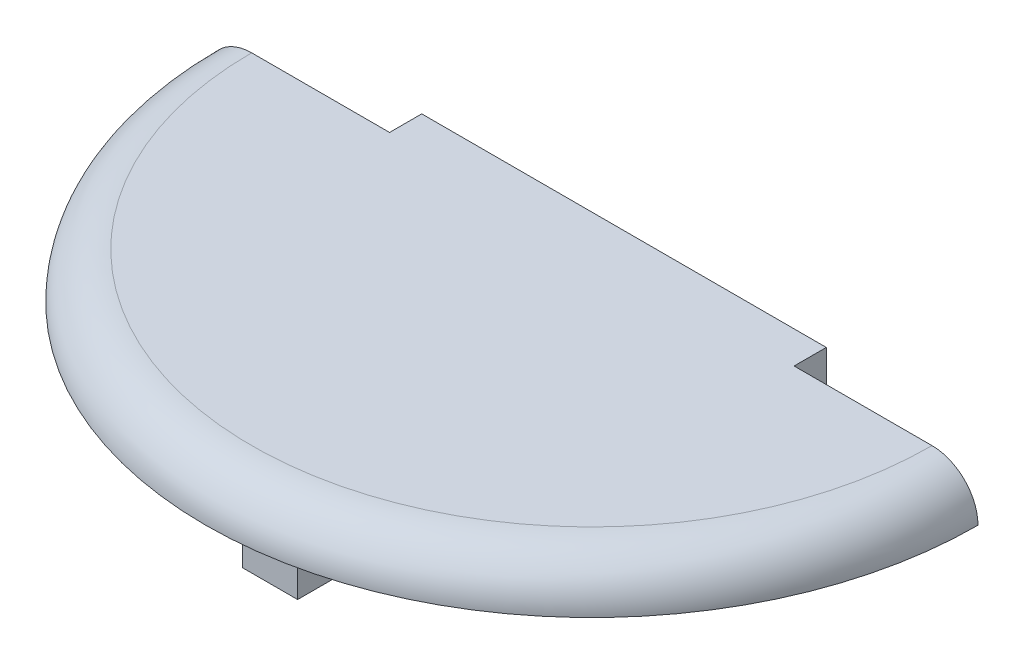
ISO-10303-21;
HEADER;
FILE_DESCRIPTION(('STEP AP214'),'2;1');
FILE_NAME('part.step','',(''),(''),'','','');
FILE_SCHEMA(('AUTOMOTIVE_DESIGN { 1 0 10303 214 1 1 1 1 }'));
ENDSEC;
DATA;
#1=APPLICATION_CONTEXT('core data for automotive mechanical design processes');
#2=APPLICATION_PROTOCOL_DEFINITION('international standard','automotive_design',2000,#1);
#3=PRODUCT_CONTEXT('',#1,'mechanical');
#4=PRODUCT('Part','Part','',(#3));
#5=PRODUCT_RELATED_PRODUCT_CATEGORY('part','',(#4));
#6=PRODUCT_DEFINITION_FORMATION('','',#4);
#7=PRODUCT_DEFINITION_CONTEXT('part definition',#1,'design');
#8=PRODUCT_DEFINITION('design','',#6,#7);
#9=PRODUCT_DEFINITION_SHAPE('','',#8);
#10=(LENGTH_UNIT() NAMED_UNIT(*) SI_UNIT(.MILLI.,.METRE.));
#11=(NAMED_UNIT(*) PLANE_ANGLE_UNIT() SI_UNIT($,.RADIAN.));
#12=(NAMED_UNIT(*) SI_UNIT($,.STERADIAN.) SOLID_ANGLE_UNIT());
#13=UNCERTAINTY_MEASURE_WITH_UNIT(LENGTH_MEASURE(1.E-05),#10,'distance_accuracy_value','');
#14=(GEOMETRIC_REPRESENTATION_CONTEXT(3) GLOBAL_UNCERTAINTY_ASSIGNED_CONTEXT((#13)) GLOBAL_UNIT_ASSIGNED_CONTEXT((#10,
#11,#12)) REPRESENTATION_CONTEXT('',''));
#15=CARTESIAN_POINT('',(0.,0.,0.));
#16=DIRECTION('',(0.,0.,1.));
#17=DIRECTION('',(1.,0.,0.));
#18=AXIS2_PLACEMENT_3D('',#15,#16,#17);
#19=CARTESIAN_POINT('',(-2.99999999999999,47.,32.));
#20=DIRECTION('',(0.,0.,1.));
#21=DIRECTION('',(1.,0.,0.));
#22=AXIS2_PLACEMENT_3D('',#19,#20,#21);
#23=PLANE('',#22);
#24=DIRECTION('',(1.,0.,0.));
#25=VECTOR('',#24,1.);
#26=CARTESIAN_POINT('',(-2.99999999999999,48.,32.));
#27=LINE('',#26,#25);
#28=CARTESIAN_POINT('',(-2.99999999999999,48.,32.));
#29=VERTEX_POINT('',#28);
#30=CARTESIAN_POINT('',(3.00000000000001,48.,32.));
#31=VERTEX_POINT('',#30);
#32=EDGE_CURVE('E12',#29,#31,#27,.T.);
#33=ORIENTED_EDGE('',*,*,#32,.F.);
#34=DIRECTION('',(0.,1.,0.));
#35=VECTOR('',#34,1.);
#36=CARTESIAN_POINT('',(-2.99999999999999,47.,32.));
#37=LINE('',#36,#35);
#38=CARTESIAN_POINT('',(-2.99999999999999,55.,32.));
#39=VERTEX_POINT('',#38);
#40=EDGE_CURVE('E226',#29,#39,#37,.T.);
#41=ORIENTED_EDGE('',*,*,#40,.T.);
#42=DIRECTION('',(1.,0.,0.));
#43=VECTOR('',#42,1.);
#44=CARTESIAN_POINT('',(-2.99999999999999,55.,32.));
#45=LINE('',#44,#43);
#46=CARTESIAN_POINT('',(3.00000000000001,55.,32.));
#47=VERTEX_POINT('',#46);
#48=EDGE_CURVE('E219',#39,#47,#45,.T.);
#49=ORIENTED_EDGE('',*,*,#48,.T.);
#50=DIRECTION('',(0.,1.,0.));
#51=VECTOR('',#50,1.);
#52=CARTESIAN_POINT('',(3.00000000000001,47.,32.));
#53=LINE('',#52,#51);
#54=EDGE_CURVE('E223',#31,#47,#53,.T.);
#55=ORIENTED_EDGE('',*,*,#54,.F.);
#56=EDGE_LOOP('',(#33,#41,#49,#55));
#57=FACE_BOUND('',#56,.T.);
#58=ADVANCED_FACE('F42',(#57),#23,.F.);
#59=CARTESIAN_POINT('',(0.,55.,0.));
#60=DIRECTION('',(0.,1.,0.));
#61=DIRECTION('',(0.,0.,1.));
#62=AXIS2_PLACEMENT_3D('',#59,#60,#61);
#63=PLANE('',#62);
#64=DIRECTION('',(0.,0.,-1.));
#65=VECTOR('',#64,1.);
#66=CARTESIAN_POINT('',(-22.,55.,0.));
#67=LINE('',#66,#65);
#68=CARTESIAN_POINT('',(-22.,55.,0.));
#69=VERTEX_POINT('',#68);
#70=CARTESIAN_POINT('',(-22.,55.,-3.5));
#71=VERTEX_POINT('',#70);
#72=EDGE_CURVE('E144',#69,#71,#67,.T.);
#73=ORIENTED_EDGE('',*,*,#72,.T.);
#74=DIRECTION('',(1.,0.,0.));
#75=VECTOR('',#74,1.);
#76=CARTESIAN_POINT('',(-22.,55.,-3.5));
#77=LINE('',#76,#75);
#78=CARTESIAN_POINT('',(22.,55.,-3.5));
#79=VERTEX_POINT('',#78);
#80=EDGE_CURVE('E130',#71,#79,#77,.T.);
#81=ORIENTED_EDGE('',*,*,#80,.T.);
#82=DIRECTION('',(0.,0.,1.));
#83=VECTOR('',#82,1.);
#84=CARTESIAN_POINT('',(22.,55.,0.));
#85=LINE('',#84,#83);
#86=CARTESIAN_POINT('',(22.,55.,0.));
#87=VERTEX_POINT('',#86);
#88=EDGE_CURVE('E156',#79,#87,#85,.T.);
#89=ORIENTED_EDGE('',*,*,#88,.T.);
#90=DIRECTION('',(1.,0.,0.));
#91=VECTOR('',#90,1.);
#92=CARTESIAN_POINT('',(0.,55.,0.));
#93=LINE('',#92,#91);
#94=CARTESIAN_POINT('',(42.,55.,0.));
#95=VERTEX_POINT('',#94);
#96=EDGE_CURVE('E163',#87,#95,#93,.T.);
#97=ORIENTED_EDGE('',*,*,#96,.T.);
#98=CARTESIAN_POINT('',(0.,55.,0.));
#99=DIRECTION('',(0.,-1.,0.));
#100=DIRECTION('',(0.,0.,-1.));
#101=AXIS2_PLACEMENT_3D('',#98,#99,#100);
#102=CIRCLE('',#101,42.);
#103=CARTESIAN_POINT('',(-42.,55.,0.));
#104=VERTEX_POINT('',#103);
#105=EDGE_CURVE('E52',#95,#104,#102,.T.);
#106=ORIENTED_EDGE('',*,*,#105,.T.);
#107=DIRECTION('',(1.,0.,0.));
#108=VECTOR('',#107,1.);
#109=CARTESIAN_POINT('',(0.,55.,0.));
#110=LINE('',#109,#108);
#111=EDGE_CURVE('E153',#104,#69,#110,.T.);
#112=ORIENTED_EDGE('',*,*,#111,.T.);
#113=EDGE_LOOP('',(#73,#81,#89,#97,#106,#112));
#114=FACE_BOUND('',#113,.T.);
#115=DIRECTION('',(0.,0.,1.));
#116=VECTOR('',#115,1.);
#117=CARTESIAN_POINT('',(3.00000000000001,55.,35.));
#118=LINE('',#117,#116);
#119=CARTESIAN_POINT('',(3.00000000000001,55.,35.));
#120=VERTEX_POINT('',#119);
#121=EDGE_CURVE('E205',#47,#120,#118,.T.);
#122=ORIENTED_EDGE('',*,*,#121,.F.);
#123=ORIENTED_EDGE('',*,*,#48,.F.);
#124=DIRECTION('',(0.,0.,-1.));
#125=VECTOR('',#124,1.);
#126=CARTESIAN_POINT('',(-2.99999999999999,55.,35.));
#127=LINE('',#126,#125);
#128=CARTESIAN_POINT('',(-2.99999999999999,55.,35.));
#129=VERTEX_POINT('',#128);
#130=EDGE_CURVE('E215',#129,#39,#127,.T.);
#131=ORIENTED_EDGE('',*,*,#130,.F.);
#132=DIRECTION('',(-1.,0.,0.));
#133=VECTOR('',#132,1.);
#134=CARTESIAN_POINT('',(-2.99999999999999,55.,35.));
#135=LINE('',#134,#133);
#136=EDGE_CURVE('E211',#120,#129,#135,.T.);
#137=ORIENTED_EDGE('',*,*,#136,.F.);
#138=EDGE_LOOP('',(#122,#123,#131,#137));
#139=FACE_BOUND('',#138,.T.);
#140=ADVANCED_FACE('F44',(#114,#139),#63,.F.);
#141=CARTESIAN_POINT('',(37.,60.,0.));
#142=DIRECTION('',(0.,1.,0.));
#143=DIRECTION('',(0.,0.,1.));
#144=AXIS2_PLACEMENT_3D('',#141,#142,#143);
#145=PLANE('',#144);
#146=DIRECTION('',(1.,0.,0.));
#147=VECTOR('',#146,1.);
#148=CARTESIAN_POINT('',(-22.,60.,-3.5));
#149=LINE('',#148,#147);
#150=CARTESIAN_POINT('',(-22.,60.,-3.5));
#151=VERTEX_POINT('',#150);
#152=CARTESIAN_POINT('',(22.,60.,-3.5));
#153=VERTEX_POINT('',#152);
#154=EDGE_CURVE('E60',#151,#153,#149,.T.);
#155=ORIENTED_EDGE('',*,*,#154,.F.);
#156=DIRECTION('',(0.,0.,-1.));
#157=VECTOR('',#156,1.);
#158=CARTESIAN_POINT('',(-22.,60.,-7.));
#159=LINE('',#158,#157);
#160=CARTESIAN_POINT('',(-22.,60.,0.));
#161=VERTEX_POINT('',#160);
#162=EDGE_CURVE('E147',#161,#151,#159,.T.);
#163=ORIENTED_EDGE('',*,*,#162,.F.);
#164=DIRECTION('',(1.,0.,0.));
#165=VECTOR('',#164,1.);
#166=CARTESIAN_POINT('',(-42.,60.,0.));
#167=LINE('',#166,#165);
#168=CARTESIAN_POINT('',(-37.,60.,0.));
#169=VERTEX_POINT('',#168);
#170=EDGE_CURVE('E258',#169,#161,#167,.T.);
#171=ORIENTED_EDGE('',*,*,#170,.F.);
#172=CARTESIAN_POINT('',(0.,60.,0.));
#173=DIRECTION('',(0.,-1.,0.));
#174=DIRECTION('',(0.,0.,-1.));
#175=AXIS2_PLACEMENT_3D('',#172,#173,#174);
#176=CIRCLE('',#175,37.);
#177=CARTESIAN_POINT('',(37.,60.,0.));
#178=VERTEX_POINT('',#177);
#179=EDGE_CURVE('E241',#178,#169,#176,.T.);
#180=ORIENTED_EDGE('',*,*,#179,.F.);
#181=DIRECTION('',(1.,0.,0.));
#182=VECTOR('',#181,1.);
#183=CARTESIAN_POINT('',(42.,60.,0.));
#184=LINE('',#183,#182);
#185=CARTESIAN_POINT('',(22.,60.,0.));
#186=VERTEX_POINT('',#185);
#187=EDGE_CURVE('E265',#186,#178,#184,.T.);
#188=ORIENTED_EDGE('',*,*,#187,.F.);
#189=DIRECTION('',(0.,0.,1.));
#190=VECTOR('',#189,1.);
#191=CARTESIAN_POINT('',(22.,60.,-7.));
#192=LINE('',#191,#190);
#193=EDGE_CURVE('E262',#153,#186,#192,.T.);
#194=ORIENTED_EDGE('',*,*,#193,.F.);
#195=EDGE_LOOP('',(#155,#163,#171,#180,#188,#194));
#196=FACE_BOUND('',#195,.T.);
#197=ADVANCED_FACE('F295',(#196),#145,.T.);
#198=CARTESIAN_POINT('',(0.,55.,0.));
#199=DIRECTION('',(0.,-1.,0.));
#200=DIRECTION('',(0.,0.,-1.));
#201=AXIS2_PLACEMENT_3D('',#198,#199,#200);
#202=TOROIDAL_SURFACE('',#201,37.,5.);
#203=CARTESIAN_POINT('',(-37.,55.,0.));
#204=DIRECTION('',(0.,0.,1.));
#205=DIRECTION('',(1.,0.,0.));
#206=AXIS2_PLACEMENT_3D('',#203,#204,#205);
#207=CIRCLE('',#206,5.);
#208=EDGE_CURVE('E238',#104,#169,#207,.F.);
#209=ORIENTED_EDGE('',*,*,#208,.F.);
#210=ORIENTED_EDGE('',*,*,#105,.F.);
#211=CARTESIAN_POINT('',(37.,55.,0.));
#212=DIRECTION('',(0.,0.,1.));
#213=DIRECTION('',(1.,0.,0.));
#214=AXIS2_PLACEMENT_3D('',#211,#212,#213);
#215=CIRCLE('',#214,5.);
#216=EDGE_CURVE('E235',#178,#95,#215,.F.);
#217=ORIENTED_EDGE('',*,*,#216,.F.);
#218=ORIENTED_EDGE('',*,*,#179,.T.);
#219=EDGE_LOOP('',(#209,#210,#217,#218));
#220=FACE_BOUND('',#219,.T.);
#221=ADVANCED_FACE('F300',(#220),#202,.T.);
#222=CARTESIAN_POINT('',(3.00000000000001,47.,35.));
#223=DIRECTION('',(-1.,0.,0.));
#224=DIRECTION('',(0.,0.,1.));
#225=AXIS2_PLACEMENT_3D('',#222,#223,#224);
#226=PLANE('',#225);
#227=DIRECTION('',(0.,0.,1.));
#228=VECTOR('',#227,1.);
#229=CARTESIAN_POINT('',(3.00000000000001,48.,35.));
#230=LINE('',#229,#228);
#231=CARTESIAN_POINT('',(3.00000000000001,48.,29.));
#232=VERTEX_POINT('',#231);
#233=EDGE_CURVE('E197',#232,#31,#230,.T.);
#234=ORIENTED_EDGE('',*,*,#233,.T.);
#235=ORIENTED_EDGE('',*,*,#54,.T.);
#236=ORIENTED_EDGE('',*,*,#121,.T.);
#237=DIRECTION('',(0.,1.,0.));
#238=VECTOR('',#237,1.);
#239=CARTESIAN_POINT('',(3.00000000000001,47.,35.));
#240=LINE('',#239,#238);
#241=CARTESIAN_POINT('',(3.00000000000001,46.,35.));
#242=VERTEX_POINT('',#241);
#243=EDGE_CURVE('E232',#242,#120,#240,.T.);
#244=ORIENTED_EDGE('',*,*,#243,.F.);
#245=DIRECTION('',(0.,0.,1.));
#246=VECTOR('',#245,1.);
#247=CARTESIAN_POINT('',(3.00000000000001,46.,35.));
#248=LINE('',#247,#246);
#249=CARTESIAN_POINT('',(3.00000000000001,46.,29.));
#250=VERTEX_POINT('',#249);
#251=EDGE_CURVE('E182',#250,#242,#248,.T.);
#252=ORIENTED_EDGE('',*,*,#251,.F.);
#253=DIRECTION('',(0.,-1.,0.));
#254=VECTOR('',#253,1.);
#255=CARTESIAN_POINT('',(3.00000000000001,48.,29.));
#256=LINE('',#255,#254);
#257=EDGE_CURVE('E202',#232,#250,#256,.T.);
#258=ORIENTED_EDGE('',*,*,#257,.F.);
#259=EDGE_LOOP('',(#234,#235,#236,#244,#252,#258));
#260=FACE_BOUND('',#259,.T.);
#261=ADVANCED_FACE('F345',(#260),#226,.F.);
#262=CARTESIAN_POINT('',(-2.99999999999999,47.,35.));
#263=DIRECTION('',(0.,0.,-1.));
#264=DIRECTION('',(-1.,0.,0.));
#265=AXIS2_PLACEMENT_3D('',#262,#263,#264);
#266=PLANE('',#265);
#267=ORIENTED_EDGE('',*,*,#243,.T.);
#268=ORIENTED_EDGE('',*,*,#136,.T.);
#269=DIRECTION('',(0.,1.,0.));
#270=VECTOR('',#269,1.);
#271=CARTESIAN_POINT('',(-2.99999999999999,47.,35.));
#272=LINE('',#271,#270);
#273=CARTESIAN_POINT('',(-2.99999999999999,46.,35.));
#274=VERTEX_POINT('',#273);
#275=EDGE_CURVE('E229',#274,#129,#272,.T.);
#276=ORIENTED_EDGE('',*,*,#275,.F.);
#277=DIRECTION('',(-1.,0.,0.));
#278=VECTOR('',#277,1.);
#279=CARTESIAN_POINT('',(-2.99999999999999,46.,35.));
#280=LINE('',#279,#278);
#281=EDGE_CURVE('E186',#242,#274,#280,.T.);
#282=ORIENTED_EDGE('',*,*,#281,.F.);
#283=EDGE_LOOP('',(#267,#268,#276,#282));
#284=FACE_BOUND('',#283,.T.);
#285=ADVANCED_FACE('F341',(#284),#266,.F.);
#286=CARTESIAN_POINT('',(-2.99999999999999,47.,35.));
#287=DIRECTION('',(1.,0.,0.));
#288=DIRECTION('',(0.,0.,-1.));
#289=AXIS2_PLACEMENT_3D('',#286,#287,#288);
#290=PLANE('',#289);
#291=ORIENTED_EDGE('',*,*,#275,.T.);
#292=ORIENTED_EDGE('',*,*,#130,.T.);
#293=ORIENTED_EDGE('',*,*,#40,.F.);
#294=DIRECTION('',(0.,0.,-1.));
#295=VECTOR('',#294,1.);
#296=CARTESIAN_POINT('',(-2.99999999999999,48.,35.));
#297=LINE('',#296,#295);
#298=CARTESIAN_POINT('',(-2.99999999999999,48.,29.));
#299=VERTEX_POINT('',#298);
#300=EDGE_CURVE('E190',#29,#299,#297,.T.);
#301=ORIENTED_EDGE('',*,*,#300,.T.);
#302=DIRECTION('',(0.,-1.,0.));
#303=VECTOR('',#302,1.);
#304=CARTESIAN_POINT('',(-2.99999999999999,48.,29.));
#305=LINE('',#304,#303);
#306=CARTESIAN_POINT('',(-2.99999999999999,46.,29.));
#307=VERTEX_POINT('',#306);
#308=EDGE_CURVE('E201',#299,#307,#305,.T.);
#309=ORIENTED_EDGE('',*,*,#308,.T.);
#310=DIRECTION('',(0.,0.,-1.));
#311=VECTOR('',#310,1.);
#312=CARTESIAN_POINT('',(-2.99999999999999,46.,35.));
#313=LINE('',#312,#311);
#314=EDGE_CURVE('E174',#274,#307,#313,.T.);
#315=ORIENTED_EDGE('',*,*,#314,.F.);
#316=EDGE_LOOP('',(#291,#292,#293,#301,#309,#315));
#317=FACE_BOUND('',#316,.T.);
#318=ADVANCED_FACE('F337',(#317),#290,.F.);
#319=CARTESIAN_POINT('',(0.,48.,0.));
#320=DIRECTION('',(0.,-1.,0.));
#321=DIRECTION('',(0.,0.,-1.));
#322=AXIS2_PLACEMENT_3D('',#319,#320,#321);
#323=PLANE('',#322);
#324=ORIENTED_EDGE('',*,*,#300,.F.);
#325=ORIENTED_EDGE('',*,*,#32,.T.);
#326=ORIENTED_EDGE('',*,*,#233,.F.);
#327=DIRECTION('',(1.,0.,0.));
#328=VECTOR('',#327,1.);
#329=CARTESIAN_POINT('',(-2.99999999999999,48.,29.));
#330=LINE('',#329,#328);
#331=EDGE_CURVE('E193',#299,#232,#330,.T.);
#332=ORIENTED_EDGE('',*,*,#331,.F.);
#333=EDGE_LOOP('',(#324,#325,#326,#332));
#334=FACE_BOUND('',#333,.T.);
#335=ADVANCED_FACE('F340',(#334),#323,.F.);
#336=CARTESIAN_POINT('',(-2.99999999999999,48.,29.));
#337=DIRECTION('',(0.,0.,-1.));
#338=DIRECTION('',(-1.,0.,0.));
#339=AXIS2_PLACEMENT_3D('',#336,#337,#338);
#340=PLANE('',#339);
#341=ORIENTED_EDGE('',*,*,#257,.T.);
#342=DIRECTION('',(1.,0.,0.));
#343=VECTOR('',#342,1.);
#344=CARTESIAN_POINT('',(-2.99999999999999,46.,29.));
#345=LINE('',#344,#343);
#346=EDGE_CURVE('E178',#307,#250,#345,.T.);
#347=ORIENTED_EDGE('',*,*,#346,.F.);
#348=ORIENTED_EDGE('',*,*,#308,.F.);
#349=ORIENTED_EDGE('',*,*,#331,.T.);
#350=EDGE_LOOP('',(#341,#347,#348,#349));
#351=FACE_BOUND('',#350,.T.);
#352=ADVANCED_FACE('F335',(#351),#340,.T.);
#353=CARTESIAN_POINT('',(0.,46.,0.));
#354=DIRECTION('',(0.,-1.,0.));
#355=DIRECTION('',(0.,0.,-1.));
#356=AXIS2_PLACEMENT_3D('',#353,#354,#355);
#357=PLANE('',#356);
#358=ORIENTED_EDGE('',*,*,#314,.T.);
#359=ORIENTED_EDGE('',*,*,#346,.T.);
#360=ORIENTED_EDGE('',*,*,#251,.T.);
#361=ORIENTED_EDGE('',*,*,#281,.T.);
#362=EDGE_LOOP('',(#358,#359,#360,#361));
#363=FACE_BOUND('',#362,.T.);
#364=ADVANCED_FACE('F418',(#363),#357,.T.);
#365=CARTESIAN_POINT('',(-22.,53.,-7.));
#366=DIRECTION('',(1.,0.,0.));
#367=DIRECTION('',(0.,0.,-1.));
#368=AXIS2_PLACEMENT_3D('',#365,#366,#367);
#369=PLANE('',#368);
#370=ORIENTED_EDGE('',*,*,#162,.T.);
#371=DIRECTION('',(0.,1.,0.));
#372=VECTOR('',#371,1.);
#373=CARTESIAN_POINT('',(-22.,55.,-3.5));
#374=LINE('',#373,#372);
#375=EDGE_CURVE('E134',#71,#151,#374,.T.);
#376=ORIENTED_EDGE('',*,*,#375,.F.);
#377=ORIENTED_EDGE('',*,*,#72,.F.);
#378=DIRECTION('',(0.,1.,0.));
#379=VECTOR('',#378,1.);
#380=CARTESIAN_POINT('',(-22.,53.,0.));
#381=LINE('',#380,#379);
#382=EDGE_CURVE('E249',#69,#161,#381,.T.);
#383=ORIENTED_EDGE('',*,*,#382,.T.);
#384=EDGE_LOOP('',(#370,#376,#377,#383));
#385=FACE_BOUND('',#384,.T.);
#386=ADVANCED_FACE('F143',(#385),#369,.F.);
#387=CARTESIAN_POINT('',(-42.,53.,0.));
#388=DIRECTION('',(0.,0.,1.));
#389=DIRECTION('',(1.,0.,0.));
#390=AXIS2_PLACEMENT_3D('',#387,#388,#389);
#391=PLANE('',#390);
#392=CARTESIAN_POINT('',(-30.,57.5,0.));
#393=DIRECTION('',(0.,0.,1.));
#394=DIRECTION('',(1.,0.,0.));
#395=AXIS2_PLACEMENT_3D('',#392,#393,#394);
#396=CIRCLE('',#395,1.35);
#397=CARTESIAN_POINT('',(-28.65,57.5,0.));
#398=VERTEX_POINT('',#397);
#399=EDGE_CURVE('E246',#398,#398,#396,.F.);
#400=ORIENTED_EDGE('',*,*,#399,.F.);
#401=EDGE_LOOP('',(#400));
#402=FACE_BOUND('',#401,.T.);
#403=ORIENTED_EDGE('',*,*,#208,.T.);
#404=ORIENTED_EDGE('',*,*,#170,.T.);
#405=ORIENTED_EDGE('',*,*,#382,.F.);
#406=ORIENTED_EDGE('',*,*,#111,.F.);
#407=EDGE_LOOP('',(#403,#404,#405,#406));
#408=FACE_BOUND('',#407,.T.);
#409=ADVANCED_FACE('F302',(#402,#408),#391,.F.);
#410=CARTESIAN_POINT('',(22.,53.,-7.));
#411=DIRECTION('',(-1.,0.,0.));
#412=DIRECTION('',(0.,0.,1.));
#413=AXIS2_PLACEMENT_3D('',#410,#411,#412);
#414=PLANE('',#413);
#415=ORIENTED_EDGE('',*,*,#88,.F.);
#416=DIRECTION('',(0.,1.,0.));
#417=VECTOR('',#416,1.);
#418=CARTESIAN_POINT('',(22.,55.,-3.5));
#419=LINE('',#418,#417);
#420=EDGE_CURVE('E135',#79,#153,#419,.T.);
#421=ORIENTED_EDGE('',*,*,#420,.T.);
#422=ORIENTED_EDGE('',*,*,#193,.T.);
#423=DIRECTION('',(0.,1.,0.));
#424=VECTOR('',#423,1.);
#425=CARTESIAN_POINT('',(22.,53.,0.));
#426=LINE('',#425,#424);
#427=EDGE_CURVE('E269',#87,#186,#426,.T.);
#428=ORIENTED_EDGE('',*,*,#427,.F.);
#429=EDGE_LOOP('',(#415,#421,#422,#428));
#430=FACE_BOUND('',#429,.T.);
#431=ADVANCED_FACE('F287',(#430),#414,.F.);
#432=CARTESIAN_POINT('',(42.,53.,0.));
#433=DIRECTION('',(0.,0.,1.));
#434=DIRECTION('',(1.,0.,0.));
#435=AXIS2_PLACEMENT_3D('',#432,#433,#434);
#436=PLANE('',#435);
#437=CARTESIAN_POINT('',(30.,57.5,0.));
#438=DIRECTION('',(0.,0.,1.));
#439=DIRECTION('',(1.,0.,0.));
#440=AXIS2_PLACEMENT_3D('',#437,#438,#439);
#441=CIRCLE('',#440,1.35);
#442=CARTESIAN_POINT('',(31.35,57.5,0.));
#443=VERTEX_POINT('',#442);
#444=EDGE_CURVE('E46',#443,#443,#441,.F.);
#445=ORIENTED_EDGE('',*,*,#444,.F.);
#446=EDGE_LOOP('',(#445));
#447=FACE_BOUND('',#446,.T.);
#448=ORIENTED_EDGE('',*,*,#427,.T.);
#449=ORIENTED_EDGE('',*,*,#187,.T.);
#450=ORIENTED_EDGE('',*,*,#216,.T.);
#451=ORIENTED_EDGE('',*,*,#96,.F.);
#452=EDGE_LOOP('',(#448,#449,#450,#451));
#453=FACE_BOUND('',#452,.T.);
#454=ADVANCED_FACE('F283',(#447,#453),#436,.F.);
#455=CARTESIAN_POINT('',(-30.,57.5,1.));
#456=DIRECTION('',(0.,0.,-1.));
#457=DIRECTION('',(-1.,0.,0.));
#458=AXIS2_PLACEMENT_3D('',#455,#456,#457);
#459=PLANE('',#458);
#460=CARTESIAN_POINT('',(-30.,57.5,1.));
#461=DIRECTION('',(0.,0.,-1.));
#462=DIRECTION('',(-1.,0.,0.));
#463=AXIS2_PLACEMENT_3D('',#460,#461,#462);
#464=CIRCLE('',#463,1.35);
#465=CARTESIAN_POINT('',(-31.35,57.5,1.));
#466=VERTEX_POINT('',#465);
#467=EDGE_CURVE('E155',#466,#466,#464,.T.);
#468=ORIENTED_EDGE('',*,*,#467,.T.);
#469=EDGE_LOOP('',(#468));
#470=FACE_BOUND('',#469,.T.);
#471=ADVANCED_FACE('F286',(#470),#459,.T.);
#472=CARTESIAN_POINT('',(-30.,57.5,1.));
#473=DIRECTION('',(0.,0.,-1.));
#474=DIRECTION('',(-1.,0.,0.));
#475=AXIS2_PLACEMENT_3D('',#472,#473,#474);
#476=CYLINDRICAL_SURFACE('',#475,1.35);
#477=ORIENTED_EDGE('',*,*,#399,.T.);
#478=EDGE_LOOP('',(#477));
#479=FACE_BOUND('',#478,.T.);
#480=ORIENTED_EDGE('',*,*,#467,.F.);
#481=EDGE_LOOP('',(#480));
#482=FACE_BOUND('',#481,.T.);
#483=ADVANCED_FACE('F384',(#479,#482),#476,.F.);
#484=CARTESIAN_POINT('',(30.,57.5,1.));
#485=DIRECTION('',(0.,0.,-1.));
#486=DIRECTION('',(-1.,0.,0.));
#487=AXIS2_PLACEMENT_3D('',#484,#485,#486);
#488=PLANE('',#487);
#489=CARTESIAN_POINT('',(30.,57.5,1.));
#490=DIRECTION('',(0.,0.,-1.));
#491=DIRECTION('',(-1.,0.,0.));
#492=AXIS2_PLACEMENT_3D('',#489,#490,#491);
#493=CIRCLE('',#492,1.35);
#494=CARTESIAN_POINT('',(28.65,57.5,1.));
#495=VERTEX_POINT('',#494);
#496=EDGE_CURVE('E161',#495,#495,#493,.T.);
#497=ORIENTED_EDGE('',*,*,#496,.T.);
#498=EDGE_LOOP('',(#497));
#499=FACE_BOUND('',#498,.T.);
#500=ADVANCED_FACE('F324',(#499),#488,.T.);
#501=CARTESIAN_POINT('',(30.,57.5,1.));
#502=DIRECTION('',(0.,0.,-1.));
#503=DIRECTION('',(-1.,0.,0.));
#504=AXIS2_PLACEMENT_3D('',#501,#502,#503);
#505=CYLINDRICAL_SURFACE('',#504,1.35);
#506=ORIENTED_EDGE('',*,*,#444,.T.);
#507=EDGE_LOOP('',(#506));
#508=FACE_BOUND('',#507,.T.);
#509=ORIENTED_EDGE('',*,*,#496,.F.);
#510=EDGE_LOOP('',(#509));
#511=FACE_BOUND('',#510,.T.);
#512=ADVANCED_FACE('F280',(#508,#511),#505,.F.);
#513=CARTESIAN_POINT('',(-22.,55.,-3.5));
#514=DIRECTION('',(0.,0.,1.));
#515=DIRECTION('',(1.,0.,0.));
#516=AXIS2_PLACEMENT_3D('',#513,#514,#515);
#517=PLANE('',#516);
#518=ORIENTED_EDGE('',*,*,#154,.T.);
#519=ORIENTED_EDGE('',*,*,#420,.F.);
#520=ORIENTED_EDGE('',*,*,#80,.F.);
#521=ORIENTED_EDGE('',*,*,#375,.T.);
#522=EDGE_LOOP('',(#518,#519,#520,#521));
#523=FACE_BOUND('',#522,.T.);
#524=CARTESIAN_POINT('',(0.,57.5,-3.5));
#525=DIRECTION('',(0.,0.,1.));
#526=DIRECTION('',(1.,0.,0.));
#527=AXIS2_PLACEMENT_3D('',#524,#525,#526);
#528=CIRCLE('',#527,1.35);
#529=CARTESIAN_POINT('',(1.35,57.5,-3.5));
#530=VERTEX_POINT('',#529);
#531=EDGE_CURVE('E266',#530,#530,#528,.F.);
#532=ORIENTED_EDGE('',*,*,#531,.F.);
#533=EDGE_LOOP('',(#532));
#534=FACE_BOUND('',#533,.T.);
#535=ADVANCED_FACE('F132',(#523,#534),#517,.F.);
#536=CARTESIAN_POINT('',(0.,57.5,1.));
#537=DIRECTION('',(0.,0.,-1.));
#538=DIRECTION('',(-1.,0.,0.));
#539=AXIS2_PLACEMENT_3D('',#536,#537,#538);
#540=PLANE('',#539);
#541=CARTESIAN_POINT('',(0.,57.5,1.));
#542=DIRECTION('',(0.,0.,-1.));
#543=DIRECTION('',(-1.,0.,0.));
#544=AXIS2_PLACEMENT_3D('',#541,#542,#543);
#545=CIRCLE('',#544,1.35);
#546=CARTESIAN_POINT('',(-1.35,57.5,1.));
#547=VERTEX_POINT('',#546);
#548=EDGE_CURVE('E169',#547,#547,#545,.T.);
#549=ORIENTED_EDGE('',*,*,#548,.T.);
#550=EDGE_LOOP('',(#549));
#551=FACE_BOUND('',#550,.T.);
#552=ADVANCED_FACE('F316',(#551),#540,.T.);
#553=CARTESIAN_POINT('',(0.,57.5,1.));
#554=DIRECTION('',(0.,0.,-1.));
#555=DIRECTION('',(-1.,0.,0.));
#556=AXIS2_PLACEMENT_3D('',#553,#554,#555);
#557=CYLINDRICAL_SURFACE('',#556,1.35);
#558=ORIENTED_EDGE('',*,*,#531,.T.);
#559=EDGE_LOOP('',(#558));
#560=FACE_BOUND('',#559,.T.);
#561=ORIENTED_EDGE('',*,*,#548,.F.);
#562=EDGE_LOOP('',(#561));
#563=FACE_BOUND('',#562,.T.);
#564=ADVANCED_FACE('F313',(#560,#563),#557,.F.);
#565=CLOSED_SHELL('',(#58,#140,#197,#221,#261,#285,#318,#335,#352,#364,#386,#409,#431,#454,#471,
#483,#500,#512,#535,#552,#564));
#566=MANIFOLD_SOLID_BREP('B2',#565);
#567=ADVANCED_BREP_SHAPE_REPRESENTATION('',(#18,#566),#14);
#568=SHAPE_DEFINITION_REPRESENTATION(#9,#567);
ENDSEC;
END-ISO-10303-21;
